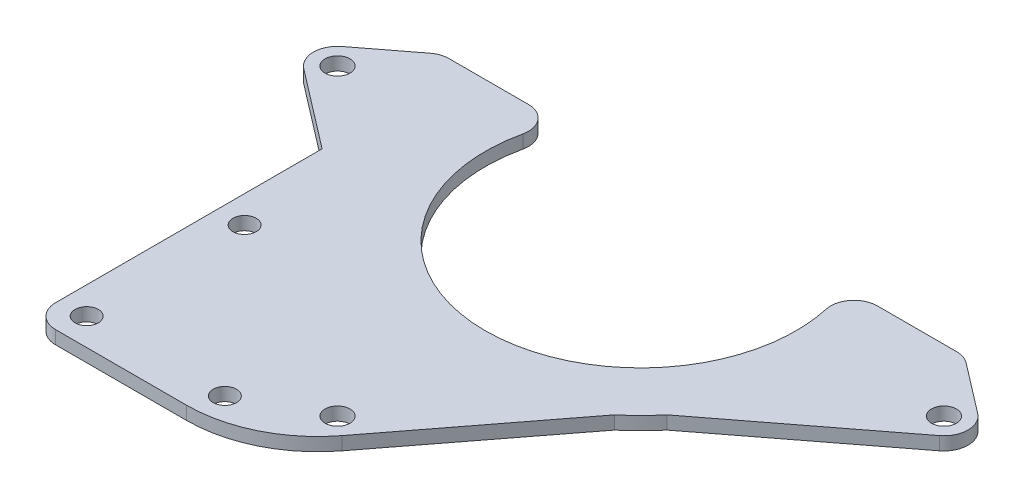
ISO-10303-21;
HEADER;
FILE_DESCRIPTION(('STEP AP214'),'2;1');
FILE_NAME('part.step','',(''),(''),'','','');
FILE_SCHEMA(('AUTOMOTIVE_DESIGN { 1 0 10303 214 1 1 1 1 }'));
ENDSEC;
DATA;
#1=APPLICATION_CONTEXT('core data for automotive mechanical design processes');
#2=APPLICATION_PROTOCOL_DEFINITION('international standard','automotive_design',2000,#1);
#3=PRODUCT_CONTEXT('',#1,'mechanical');
#4=PRODUCT('Part','Part','',(#3));
#5=PRODUCT_RELATED_PRODUCT_CATEGORY('part','',(#4));
#6=PRODUCT_DEFINITION_FORMATION('','',#4);
#7=PRODUCT_DEFINITION_CONTEXT('part definition',#1,'design');
#8=PRODUCT_DEFINITION('design','',#6,#7);
#9=PRODUCT_DEFINITION_SHAPE('','',#8);
#10=(LENGTH_UNIT() NAMED_UNIT(*) SI_UNIT(.MILLI.,.METRE.));
#11=(NAMED_UNIT(*) PLANE_ANGLE_UNIT() SI_UNIT($,.RADIAN.));
#12=(NAMED_UNIT(*) SI_UNIT($,.STERADIAN.) SOLID_ANGLE_UNIT());
#13=UNCERTAINTY_MEASURE_WITH_UNIT(LENGTH_MEASURE(1.E-05),#10,'distance_accuracy_value','');
#14=(GEOMETRIC_REPRESENTATION_CONTEXT(3) GLOBAL_UNCERTAINTY_ASSIGNED_CONTEXT((#13)) GLOBAL_UNIT_ASSIGNED_CONTEXT((#10,
#11,#12)) REPRESENTATION_CONTEXT('',''));
#15=CARTESIAN_POINT('',(0.,0.,0.));
#16=DIRECTION('',(0.,0.,1.));
#17=DIRECTION('',(1.,0.,0.));
#18=AXIS2_PLACEMENT_3D('',#15,#16,#17);
#19=CARTESIAN_POINT('',(-16.3370642064992,1.7,-21.3024503239142));
#20=DIRECTION('',(-0.608553193172273,0.,-0.793513081858031));
#21=DIRECTION('',(-0.793513081858031,0.,0.608553193172273));
#22=AXIS2_PLACEMENT_3D('',#19,#20,#21);
#23=PLANE('',#22);
#24=DIRECTION('',(0.793513081858031,0.,-0.608553193172273));
#25=VECTOR('',#24,1.);
#26=CARTESIAN_POINT('',(-16.3370642064992,1.7,-21.3024503239142));
#27=LINE('',#26,#25);
#28=CARTESIAN_POINT('',(-40.906514898834,1.7,-2.45989055376017));
#29=VERTEX_POINT('',#28);
#30=CARTESIAN_POINT('',(-34.4903147178306,1.7,-7.38053924557437));
#31=VERTEX_POINT('',#30);
#32=EDGE_CURVE('E231',#29,#31,#27,.T.);
#33=ORIENTED_EDGE('',*,*,#32,.T.);
#34=DIRECTION('',(0.,1.,0.));
#35=VECTOR('',#34,1.);
#36=CARTESIAN_POINT('',(-34.4903147178306,0.,-7.38053924557437));
#37=LINE('',#36,#35);
#38=CARTESIAN_POINT('',(-34.4903147178306,0.,-7.38053924557437));
#39=VERTEX_POINT('',#38);
#40=EDGE_CURVE('E393',#31,#39,#37,.F.);
#41=ORIENTED_EDGE('',*,*,#40,.T.);
#42=DIRECTION('',(0.793513081858031,0.,-0.608553193172273));
#43=VECTOR('',#42,1.);
#44=CARTESIAN_POINT('',(-16.3370642064992,0.,-21.3024503239142));
#45=LINE('',#44,#43);
#46=CARTESIAN_POINT('',(-40.906514898834,0.,-2.45989055376017));
#47=VERTEX_POINT('',#46);
#48=EDGE_CURVE('E224',#47,#39,#45,.T.);
#49=ORIENTED_EDGE('',*,*,#48,.F.);
#50=DIRECTION('',(0.,-1.,0.));
#51=VECTOR('',#50,1.);
#52=CARTESIAN_POINT('',(-40.906514898834,1.7,-2.45989055376017));
#53=LINE('',#52,#51);
#54=EDGE_CURVE('E333',#29,#47,#53,.T.);
#55=ORIENTED_EDGE('',*,*,#54,.F.);
#56=EDGE_LOOP('',(#33,#41,#49,#55));
#57=FACE_BOUND('',#56,.T.);
#58=ADVANCED_FACE('F51',(#57),#23,.T.);
#59=CARTESIAN_POINT('',(-39.02,1.7,-2.72475203683318E-13));
#60=DIRECTION('',(0.,-1.,0.));
#61=DIRECTION('',(0.,0.,-1.));
#62=AXIS2_PLACEMENT_3D('',#59,#60,#61);
#63=CYLINDRICAL_SURFACE('',#62,3.1);
#64=CARTESIAN_POINT('',(-39.02,0.,-2.72475203683318E-13));
#65=DIRECTION('',(0.,1.,0.));
#66=DIRECTION('',(0.,0.,1.));
#67=AXIS2_PLACEMENT_3D('',#64,#65,#66);
#68=CIRCLE('',#67,3.1);
#69=CARTESIAN_POINT('',(-40.9065148988341,0.,2.4598905537596));
#70=VERTEX_POINT('',#69);
#71=EDGE_CURVE('E280',#47,#70,#68,.T.);
#72=ORIENTED_EDGE('',*,*,#71,.T.);
#73=DIRECTION('',(0.,-1.,0.));
#74=VECTOR('',#73,1.);
#75=CARTESIAN_POINT('',(-40.9065148988341,1.7,2.4598905537596));
#76=LINE('',#75,#74);
#77=CARTESIAN_POINT('',(-40.9065148988341,1.7,2.4598905537596));
#78=VERTEX_POINT('',#77);
#79=EDGE_CURVE('E329',#78,#70,#76,.T.);
#80=ORIENTED_EDGE('',*,*,#79,.F.);
#81=CARTESIAN_POINT('',(-39.02,1.7,-2.72475203683318E-13));
#82=DIRECTION('',(0.,1.,0.));
#83=DIRECTION('',(0.,0.,1.));
#84=AXIS2_PLACEMENT_3D('',#81,#82,#83);
#85=CIRCLE('',#84,3.1);
#86=EDGE_CURVE('E235',#29,#78,#85,.T.);
#87=ORIENTED_EDGE('',*,*,#86,.F.);
#88=ORIENTED_EDGE('',*,*,#54,.T.);
#89=EDGE_LOOP('',(#72,#80,#87,#88));
#90=FACE_BOUND('',#89,.T.);
#91=ADVANCED_FACE('F478',(#90),#63,.T.);
#92=CARTESIAN_POINT('',(-16.3370642064995,1.7,21.302450323914));
#93=DIRECTION('',(-0.608553193172284,0.,0.793513081858022));
#94=DIRECTION('',(0.793513081858022,0.,0.608553193172284));
#95=AXIS2_PLACEMENT_3D('',#92,#93,#94);
#96=PLANE('',#95);
#97=DIRECTION('',(0.,1.,0.));
#98=VECTOR('',#97,1.);
#99=CARTESIAN_POINT('',(-30.78,0.,10.2260170591507));
#100=LINE('',#99,#98);
#101=CARTESIAN_POINT('',(-30.78,0.,10.2260170591507));
#102=VERTEX_POINT('',#101);
#103=CARTESIAN_POINT('',(-30.78,1.7,10.2260170591507));
#104=VERTEX_POINT('',#103);
#105=EDGE_CURVE('E198',#102,#104,#100,.T.);
#106=ORIENTED_EDGE('',*,*,#105,.T.);
#107=DIRECTION('',(-0.793513081858022,0.,-0.608553193172284));
#108=VECTOR('',#107,1.);
#109=CARTESIAN_POINT('',(-16.3370642064995,1.7,21.302450323914));
#110=LINE('',#109,#108);
#111=EDGE_CURVE('E240',#104,#78,#110,.T.);
#112=ORIENTED_EDGE('',*,*,#111,.T.);
#113=ORIENTED_EDGE('',*,*,#79,.T.);
#114=DIRECTION('',(-0.793513081858022,0.,-0.608553193172284));
#115=VECTOR('',#114,1.);
#116=CARTESIAN_POINT('',(-16.3370642064995,0.,21.302450323914));
#117=LINE('',#116,#115);
#118=EDGE_CURVE('E284',#102,#70,#117,.T.);
#119=ORIENTED_EDGE('',*,*,#118,.F.);
#120=EDGE_LOOP('',(#106,#112,#113,#119));
#121=FACE_BOUND('',#120,.T.);
#122=ADVANCED_FACE('F412',(#121),#96,.T.);
#123=CARTESIAN_POINT('',(21.302450323914,1.7,16.3370642064994));
#124=DIRECTION('',(0.793513081858025,0.,0.608553193172281));
#125=DIRECTION('',(0.608553193172281,0.,-0.793513081858025));
#126=AXIS2_PLACEMENT_3D('',#123,#124,#125);
#127=PLANE('',#126);
#128=DIRECTION('',(-0.608553193172281,0.,0.793513081858025));
#129=VECTOR('',#128,1.);
#130=CARTESIAN_POINT('',(21.302450323914,0.,16.3370642064994));
#131=LINE('',#130,#129);
#132=CARTESIAN_POINT('',(17.6737203830668,0.,21.0686878523835));
#133=VERTEX_POINT('',#132);
#134=CARTESIAN_POINT('',(2.45989055375975,0.,40.9065148988341));
#135=VERTEX_POINT('',#134);
#136=EDGE_CURVE('E206',#133,#135,#131,.T.);
#137=ORIENTED_EDGE('',*,*,#136,.F.);
#138=DIRECTION('',(0.,-1.,0.));
#139=VECTOR('',#138,1.);
#140=CARTESIAN_POINT('',(17.6737203830668,1.7,21.0686878523835));
#141=LINE('',#140,#139);
#142=CARTESIAN_POINT('',(17.6737203830668,1.7,21.0686878523835));
#143=VERTEX_POINT('',#142);
#144=EDGE_CURVE('E323',#143,#133,#141,.T.);
#145=ORIENTED_EDGE('',*,*,#144,.F.);
#146=DIRECTION('',(-0.608553193172281,0.,0.793513081858025));
#147=VECTOR('',#146,1.);
#148=CARTESIAN_POINT('',(21.302450323914,1.7,16.3370642064994));
#149=LINE('',#148,#147);
#150=CARTESIAN_POINT('',(2.45989055375975,1.7,40.9065148988341));
#151=VERTEX_POINT('',#150);
#152=EDGE_CURVE('E230',#143,#151,#149,.T.);
#153=ORIENTED_EDGE('',*,*,#152,.T.);
#154=DIRECTION('',(0.,-1.,0.));
#155=VECTOR('',#154,1.);
#156=CARTESIAN_POINT('',(2.45989055375975,1.7,40.9065148988341));
#157=LINE('',#156,#155);
#158=EDGE_CURVE('E326',#151,#135,#157,.T.);
#159=ORIENTED_EDGE('',*,*,#158,.T.);
#160=EDGE_LOOP('',(#137,#145,#153,#159));
#161=FACE_BOUND('',#160,.T.);
#162=ADVANCED_FACE('F535',(#161),#127,.T.);
#163=CARTESIAN_POINT('',(0.,1.7,0.));
#164=DIRECTION('',(0.,-1.,0.));
#165=DIRECTION('',(0.,0.,-1.));
#166=AXIS2_PLACEMENT_3D('',#163,#164,#165);
#167=CYLINDRICAL_SURFACE('',#166,27.5);
#168=CARTESIAN_POINT('',(0.,0.,0.));
#169=DIRECTION('',(0.,1.,0.));
#170=DIRECTION('',(0.,0.,1.));
#171=AXIS2_PLACEMENT_3D('',#168,#169,#170);
#172=CIRCLE('',#171,27.5);
#173=CARTESIAN_POINT('',(21.0686878523834,0.,17.6737203830668));
#174=VERTEX_POINT('',#173);
#175=EDGE_CURVE('E272',#133,#174,#172,.T.);
#176=ORIENTED_EDGE('',*,*,#175,.T.);
#177=DIRECTION('',(0.,-1.,0.));
#178=VECTOR('',#177,1.);
#179=CARTESIAN_POINT('',(21.0686878523834,1.7,17.6737203830668));
#180=LINE('',#179,#178);
#181=CARTESIAN_POINT('',(21.0686878523834,1.7,17.6737203830668));
#182=VERTEX_POINT('',#181);
#183=EDGE_CURVE('E320',#182,#174,#180,.T.);
#184=ORIENTED_EDGE('',*,*,#183,.F.);
#185=CARTESIAN_POINT('',(0.,1.7,0.));
#186=DIRECTION('',(0.,1.,0.));
#187=DIRECTION('',(0.,0.,1.));
#188=AXIS2_PLACEMENT_3D('',#185,#186,#187);
#189=CIRCLE('',#188,27.5);
#190=EDGE_CURVE('E226',#143,#182,#189,.T.);
#191=ORIENTED_EDGE('',*,*,#190,.F.);
#192=ORIENTED_EDGE('',*,*,#144,.T.);
#193=EDGE_LOOP('',(#176,#184,#191,#192));
#194=FACE_BOUND('',#193,.T.);
#195=ADVANCED_FACE('F533',(#194),#167,.T.);
#196=CARTESIAN_POINT('',(16.3370642064993,1.7,21.3024503239141));
#197=DIRECTION('',(0.608553193172279,0.,0.793513081858027));
#198=DIRECTION('',(0.793513081858027,0.,-0.608553193172279));
#199=AXIS2_PLACEMENT_3D('',#196,#197,#198);
#200=PLANE('',#199);
#201=DIRECTION('',(-0.793513081858027,0.,0.608553193172279));
#202=VECTOR('',#201,1.);
#203=CARTESIAN_POINT('',(16.3370642064993,0.,21.3024503239141));
#204=LINE('',#203,#202);
#205=CARTESIAN_POINT('',(40.9065148988341,0.,2.45989055375989));
#206=VERTEX_POINT('',#205);
#207=EDGE_CURVE('E276',#206,#174,#204,.T.);
#208=ORIENTED_EDGE('',*,*,#207,.F.);
#209=DIRECTION('',(0.,-1.,0.));
#210=VECTOR('',#209,1.);
#211=CARTESIAN_POINT('',(40.9065148988341,1.7,2.45989055375989));
#212=LINE('',#211,#210);
#213=CARTESIAN_POINT('',(40.9065148988341,1.7,2.45989055375989));
#214=VERTEX_POINT('',#213);
#215=EDGE_CURVE('E317',#214,#206,#212,.T.);
#216=ORIENTED_EDGE('',*,*,#215,.F.);
#217=DIRECTION('',(-0.793513081858027,0.,0.608553193172279));
#218=VECTOR('',#217,1.);
#219=CARTESIAN_POINT('',(16.3370642064993,1.7,21.3024503239141));
#220=LINE('',#219,#218);
#221=EDGE_CURVE('E229',#214,#182,#220,.T.);
#222=ORIENTED_EDGE('',*,*,#221,.T.);
#223=ORIENTED_EDGE('',*,*,#183,.T.);
#224=EDGE_LOOP('',(#208,#216,#222,#223));
#225=FACE_BOUND('',#224,.T.);
#226=ADVANCED_FACE('F528',(#225),#200,.T.);
#227=CARTESIAN_POINT('',(39.02,1.7,0.));
#228=DIRECTION('',(0.,-1.,0.));
#229=DIRECTION('',(0.,0.,-1.));
#230=AXIS2_PLACEMENT_3D('',#227,#228,#229);
#231=CYLINDRICAL_SURFACE('',#230,3.1);
#232=CARTESIAN_POINT('',(39.02,0.,0.));
#233=DIRECTION('',(0.,1.,0.));
#234=DIRECTION('',(0.,0.,1.));
#235=AXIS2_PLACEMENT_3D('',#232,#233,#234);
#236=CIRCLE('',#235,3.1);
#237=CARTESIAN_POINT('',(40.9065148988341,0.,-2.45989055375988));
#238=VERTEX_POINT('',#237);
#239=EDGE_CURVE('E292',#206,#238,#236,.T.);
#240=ORIENTED_EDGE('',*,*,#239,.T.);
#241=DIRECTION('',(0.,-1.,0.));
#242=VECTOR('',#241,1.);
#243=CARTESIAN_POINT('',(40.9065148988341,1.7,-2.45989055375988));
#244=LINE('',#243,#242);
#245=CARTESIAN_POINT('',(40.9065148988341,1.7,-2.45989055375988));
#246=VERTEX_POINT('',#245);
#247=EDGE_CURVE('E271',#246,#238,#244,.T.);
#248=ORIENTED_EDGE('',*,*,#247,.F.);
#249=CARTESIAN_POINT('',(39.02,1.7,0.));
#250=DIRECTION('',(0.,1.,0.));
#251=DIRECTION('',(0.,0.,1.));
#252=AXIS2_PLACEMENT_3D('',#249,#250,#251);
#253=CIRCLE('',#252,3.1);
#254=EDGE_CURVE('E248',#214,#246,#253,.T.);
#255=ORIENTED_EDGE('',*,*,#254,.F.);
#256=ORIENTED_EDGE('',*,*,#215,.T.);
#257=EDGE_LOOP('',(#240,#248,#255,#256));
#258=FACE_BOUND('',#257,.T.);
#259=ADVANCED_FACE('F525',(#258),#231,.T.);
#260=CARTESIAN_POINT('',(16.3370642064993,1.7,-21.3024503239141));
#261=DIRECTION('',(0.608553193172278,0.,-0.793513081858027));
#262=DIRECTION('',(-0.793513081858027,0.,-0.608553193172278));
#263=AXIS2_PLACEMENT_3D('',#260,#261,#262);
#264=PLANE('',#263);
#265=DIRECTION('',(0.793513081858027,0.,0.608553193172278));
#266=VECTOR('',#265,1.);
#267=CARTESIAN_POINT('',(16.3370642064993,0.,-21.3024503239141));
#268=LINE('',#267,#266);
#269=CARTESIAN_POINT('',(34.4903147178303,0.,-7.38053924557435));
#270=VERTEX_POINT('',#269);
#271=EDGE_CURVE('E296',#270,#238,#268,.T.);
#272=ORIENTED_EDGE('',*,*,#271,.F.);
#273=DIRECTION('',(0.,1.,0.));
#274=VECTOR('',#273,1.);
#275=CARTESIAN_POINT('',(34.4903147178303,1.7,-7.38053924557435));
#276=LINE('',#275,#274);
#277=CARTESIAN_POINT('',(34.4903147178303,1.7,-7.38053924557435));
#278=VERTEX_POINT('',#277);
#279=EDGE_CURVE('E339',#270,#278,#276,.T.);
#280=ORIENTED_EDGE('',*,*,#279,.T.);
#281=DIRECTION('',(0.793513081858027,0.,0.608553193172278));
#282=VECTOR('',#281,1.);
#283=CARTESIAN_POINT('',(16.3370642064993,1.7,-21.3024503239141));
#284=LINE('',#283,#282);
#285=EDGE_CURVE('E252',#278,#246,#284,.T.);
#286=ORIENTED_EDGE('',*,*,#285,.T.);
#287=ORIENTED_EDGE('',*,*,#247,.T.);
#288=EDGE_LOOP('',(#272,#280,#286,#287));
#289=FACE_BOUND('',#288,.T.);
#290=ADVANCED_FACE('F521',(#289),#264,.T.);
#291=CARTESIAN_POINT('',(-1.36237601841659E-13,1.7,39.02));
#292=DIRECTION('',(0.,-1.,0.));
#293=DIRECTION('',(0.,0.,-1.));
#294=AXIS2_PLACEMENT_3D('',#291,#292,#293);
#295=CYLINDRICAL_SURFACE('',#294,1.6);
#296=CARTESIAN_POINT('',(-1.36237601841659E-13,1.7,39.02));
#297=DIRECTION('',(0.,1.,0.));
#298=DIRECTION('',(0.,0.,1.));
#299=AXIS2_PLACEMENT_3D('',#296,#297,#298);
#300=CIRCLE('',#299,1.6);
#301=CARTESIAN_POINT('',(-1.36237601841659E-13,1.7,40.62));
#302=VERTEX_POINT('',#301);
#303=EDGE_CURVE('E263',#302,#302,#300,.T.);
#304=ORIENTED_EDGE('',*,*,#303,.T.);
#305=EDGE_LOOP('',(#304));
#306=FACE_BOUND('',#305,.T.);
#307=CARTESIAN_POINT('',(-1.36237601841659E-13,0.,39.02));
#308=DIRECTION('',(0.,1.,0.));
#309=DIRECTION('',(0.,0.,1.));
#310=AXIS2_PLACEMENT_3D('',#307,#308,#309);
#311=CIRCLE('',#310,1.6);
#312=CARTESIAN_POINT('',(-1.36237601841659E-13,0.,40.62));
#313=VERTEX_POINT('',#312);
#314=EDGE_CURVE('E307',#313,#313,#311,.T.);
#315=ORIENTED_EDGE('',*,*,#314,.F.);
#316=EDGE_LOOP('',(#315));
#317=FACE_BOUND('',#316,.T.);
#318=ADVANCED_FACE('F550',(#306,#317),#295,.F.);
#319=CARTESIAN_POINT('',(39.02,1.7,0.));
#320=DIRECTION('',(0.,-1.,0.));
#321=DIRECTION('',(0.,0.,-1.));
#322=AXIS2_PLACEMENT_3D('',#319,#320,#321);
#323=CYLINDRICAL_SURFACE('',#322,1.60000000000001);
#324=CARTESIAN_POINT('',(39.02,1.7,0.));
#325=DIRECTION('',(0.,1.,0.));
#326=DIRECTION('',(0.,0.,1.));
#327=AXIS2_PLACEMENT_3D('',#324,#325,#326);
#328=CIRCLE('',#327,1.60000000000001);
#329=CARTESIAN_POINT('',(39.02,1.7,1.60000000000001));
#330=VERTEX_POINT('',#329);
#331=EDGE_CURVE('E259',#330,#330,#328,.T.);
#332=ORIENTED_EDGE('',*,*,#331,.T.);
#333=EDGE_LOOP('',(#332));
#334=FACE_BOUND('',#333,.T.);
#335=CARTESIAN_POINT('',(39.02,0.,0.));
#336=DIRECTION('',(0.,1.,0.));
#337=DIRECTION('',(0.,0.,1.));
#338=AXIS2_PLACEMENT_3D('',#335,#336,#337);
#339=CIRCLE('',#338,1.60000000000001);
#340=CARTESIAN_POINT('',(39.02,0.,1.60000000000001));
#341=VERTEX_POINT('',#340);
#342=EDGE_CURVE('E303',#341,#341,#339,.T.);
#343=ORIENTED_EDGE('',*,*,#342,.F.);
#344=EDGE_LOOP('',(#343));
#345=FACE_BOUND('',#344,.T.);
#346=ADVANCED_FACE('F554',(#334,#345),#323,.F.);
#347=CARTESIAN_POINT('',(0.,1.7,0.));
#348=DIRECTION('',(0.,-1.,0.));
#349=DIRECTION('',(0.,0.,-1.));
#350=AXIS2_PLACEMENT_3D('',#347,#348,#349);
#351=CYLINDRICAL_SURFACE('',#350,20.);
#352=CARTESIAN_POINT('',(0.,1.7,0.));
#353=DIRECTION('',(0.,1.,0.));
#354=DIRECTION('',(0.,0.,1.));
#355=AXIS2_PLACEMENT_3D('',#352,#353,#354);
#356=CIRCLE('',#355,20.);
#357=CARTESIAN_POINT('',(-19.5216907136031,1.7,-4.34782608695676));
#358=VERTEX_POINT('',#357);
#359=CARTESIAN_POINT('',(19.5216907136031,1.7,-4.34782608695676));
#360=VERTEX_POINT('',#359);
#361=EDGE_CURVE('E255',#358,#360,#356,.T.);
#362=ORIENTED_EDGE('',*,*,#361,.T.);
#363=DIRECTION('',(0.,-1.,0.));
#364=VECTOR('',#363,1.);
#365=CARTESIAN_POINT('',(19.5216907136031,1.7,-4.34782608695676));
#366=LINE('',#365,#364);
#367=CARTESIAN_POINT('',(19.5216907136031,0.,-4.34782608695676));
#368=VERTEX_POINT('',#367);
#369=EDGE_CURVE('E382',#360,#368,#366,.T.);
#370=ORIENTED_EDGE('',*,*,#369,.T.);
#371=CARTESIAN_POINT('',(0.,0.,0.));
#372=DIRECTION('',(0.,1.,0.));
#373=DIRECTION('',(0.,0.,1.));
#374=AXIS2_PLACEMENT_3D('',#371,#372,#373);
#375=CIRCLE('',#374,20.);
#376=CARTESIAN_POINT('',(-19.5216907136031,0.,-4.34782608695676));
#377=VERTEX_POINT('',#376);
#378=EDGE_CURVE('E299',#377,#368,#375,.T.);
#379=ORIENTED_EDGE('',*,*,#378,.F.);
#380=DIRECTION('',(0.,-1.,0.));
#381=VECTOR('',#380,1.);
#382=CARTESIAN_POINT('',(-19.5216907136031,1.7,-4.34782608695676));
#383=LINE('',#382,#381);
#384=EDGE_CURVE('E379',#377,#358,#383,.F.);
#385=ORIENTED_EDGE('',*,*,#384,.T.);
#386=EDGE_LOOP('',(#362,#370,#379,#385));
#387=FACE_BOUND('',#386,.T.);
#388=ADVANCED_FACE('F473',(#387),#351,.F.);
#389=CARTESIAN_POINT('',(-39.02,1.7,-2.72475203683318E-13));
#390=DIRECTION('',(0.,-1.,0.));
#391=DIRECTION('',(0.,0.,-1.));
#392=AXIS2_PLACEMENT_3D('',#389,#390,#391);
#393=CYLINDRICAL_SURFACE('',#392,1.6);
#394=CARTESIAN_POINT('',(-39.02,1.7,-2.72475203683318E-13));
#395=DIRECTION('',(0.,1.,0.));
#396=DIRECTION('',(0.,0.,1.));
#397=AXIS2_PLACEMENT_3D('',#394,#395,#396);
#398=CIRCLE('',#397,1.6);
#399=CARTESIAN_POINT('',(-39.02,1.7,1.59999999999973));
#400=VERTEX_POINT('',#399);
#401=EDGE_CURVE('E267',#400,#400,#398,.T.);
#402=ORIENTED_EDGE('',*,*,#401,.T.);
#403=EDGE_LOOP('',(#402));
#404=FACE_BOUND('',#403,.T.);
#405=CARTESIAN_POINT('',(-39.02,0.,-2.72475203683318E-13));
#406=DIRECTION('',(0.,1.,0.));
#407=DIRECTION('',(0.,0.,1.));
#408=AXIS2_PLACEMENT_3D('',#405,#406,#407);
#409=CIRCLE('',#408,1.6);
#410=CARTESIAN_POINT('',(-39.02,0.,1.59999999999973));
#411=VERTEX_POINT('',#410);
#412=EDGE_CURVE('E236',#411,#411,#409,.T.);
#413=ORIENTED_EDGE('',*,*,#412,.F.);
#414=EDGE_LOOP('',(#413));
#415=FACE_BOUND('',#414,.T.);
#416=ADVANCED_FACE('F465',(#404,#415),#393,.F.);
#417=CARTESIAN_POINT('',(0.,1.7,0.));
#418=DIRECTION('',(0.,1.,0.));
#419=DIRECTION('',(0.,0.,1.));
#420=AXIS2_PLACEMENT_3D('',#417,#418,#419);
#421=PLANE('',#420);
#422=ORIENTED_EDGE('',*,*,#285,.F.);
#423=CARTESIAN_POINT('',(32.6646551383135,1.7,-5.00000000000027));
#424=DIRECTION('',(0.,1.,0.));
#425=DIRECTION('',(0.,0.,1.));
#426=AXIS2_PLACEMENT_3D('',#423,#424,#425);
#427=CIRCLE('',#426,3.);
#428=CARTESIAN_POINT('',(32.6646551383135,1.7,-8.00000000000027));
#429=VERTEX_POINT('',#428);
#430=EDGE_CURVE('E355',#278,#429,#427,.T.);
#431=ORIENTED_EDGE('',*,*,#430,.T.);
#432=DIRECTION('',(1.,0.,0.));
#433=VECTOR('',#432,1.);
#434=CARTESIAN_POINT('',(-33.6825788981034,1.7,-8.00000000000027));
#435=LINE('',#434,#433);
#436=CARTESIAN_POINT('',(22.4499443206436,1.7,-8.00000000000027));
#437=VERTEX_POINT('',#436);
#438=EDGE_CURVE('E439',#437,#429,#435,.T.);
#439=ORIENTED_EDGE('',*,*,#438,.F.);
#440=CARTESIAN_POINT('',(22.4499443206436,1.7,-5.00000000000027));
#441=DIRECTION('',(0.,1.,0.));
#442=DIRECTION('',(0.,0.,1.));
#443=AXIS2_PLACEMENT_3D('',#440,#441,#442);
#444=CIRCLE('',#443,3.);
#445=EDGE_CURVE('E352',#437,#360,#444,.T.);
#446=ORIENTED_EDGE('',*,*,#445,.T.);
#447=ORIENTED_EDGE('',*,*,#361,.F.);
#448=CARTESIAN_POINT('',(-22.4499443206436,1.7,-5.00000000000027));
#449=DIRECTION('',(0.,1.,0.));
#450=DIRECTION('',(0.,0.,1.));
#451=AXIS2_PLACEMENT_3D('',#448,#449,#450);
#452=CIRCLE('',#451,3.);
#453=CARTESIAN_POINT('',(-22.4499443206436,1.7,-8.00000000000027));
#454=VERTEX_POINT('',#453);
#455=EDGE_CURVE('E346',#358,#454,#452,.T.);
#456=ORIENTED_EDGE('',*,*,#455,.T.);
#457=CARTESIAN_POINT('',(-32.6646551383138,1.7,-8.00000000000027));
#458=VERTEX_POINT('',#457);
#459=EDGE_CURVE('E432',#458,#454,#435,.T.);
#460=ORIENTED_EDGE('',*,*,#459,.F.);
#461=CARTESIAN_POINT('',(-32.6646551383138,1.7,-5.00000000000027));
#462=DIRECTION('',(0.,1.,0.));
#463=DIRECTION('',(0.,0.,1.));
#464=AXIS2_PLACEMENT_3D('',#461,#462,#463);
#465=CIRCLE('',#464,3.);
#466=EDGE_CURVE('E349',#458,#31,#465,.T.);
#467=ORIENTED_EDGE('',*,*,#466,.T.);
#468=ORIENTED_EDGE('',*,*,#32,.F.);
#469=ORIENTED_EDGE('',*,*,#86,.T.);
#470=ORIENTED_EDGE('',*,*,#111,.F.);
#471=DIRECTION('',(0.,0.,1.));
#472=VECTOR('',#471,1.);
#473=CARTESIAN_POINT('',(-30.78,1.7,47.52));
#474=LINE('',#473,#472);
#475=CARTESIAN_POINT('',(-30.78,1.7,44.52));
#476=VERTEX_POINT('',#475);
#477=EDGE_CURVE('E189',#104,#476,#474,.T.);
#478=ORIENTED_EDGE('',*,*,#477,.T.);
#479=CARTESIAN_POINT('',(-27.78,1.7,44.52));
#480=DIRECTION('',(0.,1.,0.));
#481=DIRECTION('',(0.,0.,1.));
#482=AXIS2_PLACEMENT_3D('',#479,#480,#481);
#483=CIRCLE('',#482,3.);
#484=CARTESIAN_POINT('',(-27.78,1.7,47.52));
#485=VERTEX_POINT('',#484);
#486=EDGE_CURVE('E343',#476,#485,#483,.T.);
#487=ORIENTED_EDGE('',*,*,#486,.T.);
#488=DIRECTION('',(1.,0.,0.));
#489=VECTOR('',#488,1.);
#490=CARTESIAN_POINT('',(-30.78,1.7,47.52));
#491=LINE('',#490,#489);
#492=CARTESIAN_POINT('',(-10.9464953278294,1.7,47.52));
#493=VERTEX_POINT('',#492);
#494=EDGE_CURVE('E214',#485,#493,#491,.T.);
#495=ORIENTED_EDGE('',*,*,#494,.T.);
#496=CARTESIAN_POINT('',(-10.9464953278294,1.7,30.6250222257232));
#497=DIRECTION('',(0.,1.,0.));
#498=DIRECTION('',(0.,0.,-1.));
#499=AXIS2_PLACEMENT_3D('',#496,#497,#498);
#500=CIRCLE('',#499,16.8949777742768);
#501=EDGE_CURVE('E196',#493,#151,#500,.T.);
#502=ORIENTED_EDGE('',*,*,#501,.T.);
#503=ORIENTED_EDGE('',*,*,#152,.F.);
#504=ORIENTED_EDGE('',*,*,#190,.T.);
#505=ORIENTED_EDGE('',*,*,#221,.F.);
#506=ORIENTED_EDGE('',*,*,#254,.T.);
#507=EDGE_LOOP('',(#422,#431,#439,#446,#447,#456,#460,#467,#468,#469,#470,#478,#487,#495,#502,
#503,#504,#505,#506));
#508=FACE_BOUND('',#507,.T.);
#509=ORIENTED_EDGE('',*,*,#331,.F.);
#510=EDGE_LOOP('',(#509));
#511=FACE_BOUND('',#510,.T.);
#512=ORIENTED_EDGE('',*,*,#303,.F.);
#513=EDGE_LOOP('',(#512));
#514=FACE_BOUND('',#513,.T.);
#515=ORIENTED_EDGE('',*,*,#401,.F.);
#516=EDGE_LOOP('',(#515));
#517=FACE_BOUND('',#516,.T.);
#518=CARTESIAN_POINT('',(-27.28,1.7,44.02));
#519=DIRECTION('',(0.,1.,0.));
#520=DIRECTION('',(0.,0.,1.));
#521=AXIS2_PLACEMENT_3D('',#518,#519,#520);
#522=CIRCLE('',#521,1.5);
#523=CARTESIAN_POINT('',(-27.28,1.7,45.52));
#524=VERTEX_POINT('',#523);
#525=EDGE_CURVE('E431',#524,#524,#522,.T.);
#526=ORIENTED_EDGE('',*,*,#525,.F.);
#527=EDGE_LOOP('',(#526));
#528=FACE_BOUND('',#527,.T.);
#529=CARTESIAN_POINT('',(-27.28,1.7,23.7));
#530=DIRECTION('',(0.,1.,0.));
#531=DIRECTION('',(0.,0.,1.));
#532=AXIS2_PLACEMENT_3D('',#529,#530,#531);
#533=CIRCLE('',#532,1.5);
#534=CARTESIAN_POINT('',(-27.28,1.7,25.2));
#535=VERTEX_POINT('',#534);
#536=EDGE_CURVE('E446',#535,#535,#533,.T.);
#537=ORIENTED_EDGE('',*,*,#536,.F.);
#538=EDGE_LOOP('',(#537));
#539=FACE_BOUND('',#538,.T.);
#540=CARTESIAN_POINT('',(-9.5,1.7,44.02));
#541=DIRECTION('',(0.,1.,0.));
#542=DIRECTION('',(0.,0.,1.));
#543=AXIS2_PLACEMENT_3D('',#540,#541,#542);
#544=CIRCLE('',#543,1.5);
#545=CARTESIAN_POINT('',(-9.5,1.7,45.52));
#546=VERTEX_POINT('',#545);
#547=EDGE_CURVE('E452',#546,#546,#544,.T.);
#548=ORIENTED_EDGE('',*,*,#547,.F.);
#549=EDGE_LOOP('',(#548));
#550=FACE_BOUND('',#549,.T.);
#551=ADVANCED_FACE('F406',(#508,#511,#514,#517,#528,#539,#550),#421,.T.);
#552=CARTESIAN_POINT('',(0.,0.,0.));
#553=DIRECTION('',(0.,1.,0.));
#554=DIRECTION('',(0.,0.,1.));
#555=AXIS2_PLACEMENT_3D('',#552,#553,#554);
#556=PLANE('',#555);
#557=DIRECTION('',(1.,0.,0.));
#558=VECTOR('',#557,1.);
#559=CARTESIAN_POINT('',(0.,0.,-8.00000000000027));
#560=LINE('',#559,#558);
#561=CARTESIAN_POINT('',(22.4499443206436,0.,-8.00000000000027));
#562=VERTEX_POINT('',#561);
#563=CARTESIAN_POINT('',(32.6646551383135,0.,-8.00000000000027));
#564=VERTEX_POINT('',#563);
#565=EDGE_CURVE('E336',#562,#564,#560,.T.);
#566=ORIENTED_EDGE('',*,*,#565,.T.);
#567=CARTESIAN_POINT('',(32.6646551383135,0.,-5.00000000000027));
#568=DIRECTION('',(0.,1.,0.));
#569=DIRECTION('',(0.,0.,1.));
#570=AXIS2_PLACEMENT_3D('',#567,#568,#569);
#571=CIRCLE('',#570,3.);
#572=EDGE_CURVE('E376',#564,#270,#571,.F.);
#573=ORIENTED_EDGE('',*,*,#572,.T.);
#574=ORIENTED_EDGE('',*,*,#271,.T.);
#575=ORIENTED_EDGE('',*,*,#239,.F.);
#576=ORIENTED_EDGE('',*,*,#207,.T.);
#577=ORIENTED_EDGE('',*,*,#175,.F.);
#578=ORIENTED_EDGE('',*,*,#136,.T.);
#579=CARTESIAN_POINT('',(-10.9464953278294,0.,30.6250222257232));
#580=DIRECTION('',(0.,1.,0.));
#581=DIRECTION('',(0.,0.,-1.));
#582=AXIS2_PLACEMENT_3D('',#579,#580,#581);
#583=CIRCLE('',#582,16.8949777742768);
#584=CARTESIAN_POINT('',(-10.9464953278294,0.,47.52));
#585=VERTEX_POINT('',#584);
#586=EDGE_CURVE('E188',#585,#135,#583,.T.);
#587=ORIENTED_EDGE('',*,*,#586,.F.);
#588=DIRECTION('',(1.,0.,0.));
#589=VECTOR('',#588,1.);
#590=CARTESIAN_POINT('',(-30.78,0.,47.52));
#591=LINE('',#590,#589);
#592=CARTESIAN_POINT('',(-27.78,0.,47.52));
#593=VERTEX_POINT('',#592);
#594=EDGE_CURVE('E181',#593,#585,#591,.T.);
#595=ORIENTED_EDGE('',*,*,#594,.F.);
#596=CARTESIAN_POINT('',(-27.78,0.,44.52));
#597=DIRECTION('',(0.,1.,0.));
#598=DIRECTION('',(0.,0.,1.));
#599=AXIS2_PLACEMENT_3D('',#596,#597,#598);
#600=CIRCLE('',#599,3.);
#601=CARTESIAN_POINT('',(-30.78,0.,44.52));
#602=VERTEX_POINT('',#601);
#603=EDGE_CURVE('E67',#593,#602,#600,.F.);
#604=ORIENTED_EDGE('',*,*,#603,.T.);
#605=DIRECTION('',(0.,0.,1.));
#606=VECTOR('',#605,1.);
#607=CARTESIAN_POINT('',(-30.78,0.,47.52));
#608=LINE('',#607,#606);
#609=EDGE_CURVE('E199',#102,#602,#608,.T.);
#610=ORIENTED_EDGE('',*,*,#609,.F.);
#611=ORIENTED_EDGE('',*,*,#118,.T.);
#612=ORIENTED_EDGE('',*,*,#71,.F.);
#613=ORIENTED_EDGE('',*,*,#48,.T.);
#614=CARTESIAN_POINT('',(-32.6646551383138,0.,-5.00000000000027));
#615=DIRECTION('',(0.,1.,0.));
#616=DIRECTION('',(0.,0.,1.));
#617=AXIS2_PLACEMENT_3D('',#614,#615,#616);
#618=CIRCLE('',#617,3.);
#619=CARTESIAN_POINT('',(-32.6646551383138,0.,-8.00000000000027));
#620=VERTEX_POINT('',#619);
#621=EDGE_CURVE('E370',#39,#620,#618,.F.);
#622=ORIENTED_EDGE('',*,*,#621,.T.);
#623=DIRECTION('',(1.,0.,0.));
#624=VECTOR('',#623,1.);
#625=CARTESIAN_POINT('',(-33.6825788981034,0.,-8.00000000000027));
#626=LINE('',#625,#624);
#627=CARTESIAN_POINT('',(-22.4499443206436,0.,-8.00000000000027));
#628=VERTEX_POINT('',#627);
#629=EDGE_CURVE('E424',#620,#628,#626,.T.);
#630=ORIENTED_EDGE('',*,*,#629,.T.);
#631=CARTESIAN_POINT('',(-22.4499443206436,0.,-5.00000000000027));
#632=DIRECTION('',(0.,1.,0.));
#633=DIRECTION('',(0.,0.,1.));
#634=AXIS2_PLACEMENT_3D('',#631,#632,#633);
#635=CIRCLE('',#634,3.);
#636=EDGE_CURVE('E367',#628,#377,#635,.F.);
#637=ORIENTED_EDGE('',*,*,#636,.T.);
#638=ORIENTED_EDGE('',*,*,#378,.T.);
#639=CARTESIAN_POINT('',(22.4499443206436,0.,-5.00000000000027));
#640=DIRECTION('',(0.,1.,0.));
#641=DIRECTION('',(0.,0.,1.));
#642=AXIS2_PLACEMENT_3D('',#639,#640,#641);
#643=CIRCLE('',#642,3.);
#644=EDGE_CURVE('E373',#368,#562,#643,.F.);
#645=ORIENTED_EDGE('',*,*,#644,.T.);
#646=EDGE_LOOP('',(#566,#573,#574,#575,#576,#577,#578,#587,#595,#604,#610,#611,#612,#613,#622,
#630,#637,#638,#645));
#647=FACE_BOUND('',#646,.T.);
#648=ORIENTED_EDGE('',*,*,#342,.T.);
#649=EDGE_LOOP('',(#648));
#650=FACE_BOUND('',#649,.T.);
#651=ORIENTED_EDGE('',*,*,#314,.T.);
#652=EDGE_LOOP('',(#651));
#653=FACE_BOUND('',#652,.T.);
#654=ORIENTED_EDGE('',*,*,#412,.T.);
#655=EDGE_LOOP('',(#654));
#656=FACE_BOUND('',#655,.T.);
#657=CARTESIAN_POINT('',(-27.28,0.,44.02));
#658=DIRECTION('',(0.,1.,0.));
#659=DIRECTION('',(0.,0.,1.));
#660=AXIS2_PLACEMENT_3D('',#657,#658,#659);
#661=CIRCLE('',#660,1.5);
#662=CARTESIAN_POINT('',(-27.28,0.,45.52));
#663=VERTEX_POINT('',#662);
#664=EDGE_CURVE('E437',#663,#663,#661,.T.);
#665=ORIENTED_EDGE('',*,*,#664,.T.);
#666=EDGE_LOOP('',(#665));
#667=FACE_BOUND('',#666,.T.);
#668=CARTESIAN_POINT('',(-27.28,0.,23.7));
#669=DIRECTION('',(0.,1.,0.));
#670=DIRECTION('',(0.,0.,1.));
#671=AXIS2_PLACEMENT_3D('',#668,#669,#670);
#672=CIRCLE('',#671,1.5);
#673=CARTESIAN_POINT('',(-27.28,0.,25.2));
#674=VERTEX_POINT('',#673);
#675=EDGE_CURVE('E448',#674,#674,#672,.T.);
#676=ORIENTED_EDGE('',*,*,#675,.T.);
#677=EDGE_LOOP('',(#676));
#678=FACE_BOUND('',#677,.T.);
#679=CARTESIAN_POINT('',(-9.5,0.,44.02));
#680=DIRECTION('',(0.,1.,0.));
#681=DIRECTION('',(0.,0.,1.));
#682=AXIS2_PLACEMENT_3D('',#679,#680,#681);
#683=CIRCLE('',#682,1.5);
#684=CARTESIAN_POINT('',(-9.5,0.,45.52));
#685=VERTEX_POINT('',#684);
#686=EDGE_CURVE('E217',#685,#685,#683,.T.);
#687=ORIENTED_EDGE('',*,*,#686,.T.);
#688=EDGE_LOOP('',(#687));
#689=FACE_BOUND('',#688,.T.);
#690=ADVANCED_FACE('F202',(#647,#650,#653,#656,#667,#678,#689),#556,.F.);
#691=CARTESIAN_POINT('',(-30.78,0.,47.52));
#692=DIRECTION('',(0.,0.,1.));
#693=DIRECTION('',(1.,0.,0.));
#694=AXIS2_PLACEMENT_3D('',#691,#692,#693);
#695=PLANE('',#694);
#696=ORIENTED_EDGE('',*,*,#494,.F.);
#697=DIRECTION('',(0.,1.,0.));
#698=VECTOR('',#697,1.);
#699=CARTESIAN_POINT('',(-27.78,0.,47.52));
#700=LINE('',#699,#698);
#701=EDGE_CURVE('E11',#485,#593,#700,.F.);
#702=ORIENTED_EDGE('',*,*,#701,.T.);
#703=ORIENTED_EDGE('',*,*,#594,.T.);
#704=DIRECTION('',(0.,1.,0.));
#705=VECTOR('',#704,1.);
#706=CARTESIAN_POINT('',(-10.9464953278294,0.,47.52));
#707=LINE('',#706,#705);
#708=EDGE_CURVE('E184',#585,#493,#707,.T.);
#709=ORIENTED_EDGE('',*,*,#708,.T.);
#710=EDGE_LOOP('',(#696,#702,#703,#709));
#711=FACE_BOUND('',#710,.T.);
#712=ADVANCED_FACE('F183',(#711),#695,.T.);
#713=CARTESIAN_POINT('',(-30.78,0.,47.52));
#714=DIRECTION('',(-1.,0.,0.));
#715=DIRECTION('',(0.,0.,1.));
#716=AXIS2_PLACEMENT_3D('',#713,#714,#715);
#717=PLANE('',#716);
#718=ORIENTED_EDGE('',*,*,#609,.T.);
#719=DIRECTION('',(0.,1.,0.));
#720=VECTOR('',#719,1.);
#721=CARTESIAN_POINT('',(-30.78,0.,44.52));
#722=LINE('',#721,#720);
#723=EDGE_CURVE('E60',#602,#476,#722,.T.);
#724=ORIENTED_EDGE('',*,*,#723,.T.);
#725=ORIENTED_EDGE('',*,*,#477,.F.);
#726=ORIENTED_EDGE('',*,*,#105,.F.);
#727=EDGE_LOOP('',(#718,#724,#725,#726));
#728=FACE_BOUND('',#727,.T.);
#729=ADVANCED_FACE('F400',(#728),#717,.T.);
#730=CARTESIAN_POINT('',(-10.9464953278294,0.,30.6250222257232));
#731=DIRECTION('',(0.,1.,0.));
#732=DIRECTION('',(0.,0.,1.));
#733=AXIS2_PLACEMENT_3D('',#730,#731,#732);
#734=CYLINDRICAL_SURFACE('',#733,16.8949777742768);
#735=ORIENTED_EDGE('',*,*,#501,.F.);
#736=ORIENTED_EDGE('',*,*,#708,.F.);
#737=ORIENTED_EDGE('',*,*,#586,.T.);
#738=ORIENTED_EDGE('',*,*,#158,.F.);
#739=EDGE_LOOP('',(#735,#736,#737,#738));
#740=FACE_BOUND('',#739,.T.);
#741=ADVANCED_FACE('F193',(#740),#734,.T.);
#742=CARTESIAN_POINT('',(-9.5,0.,44.02));
#743=DIRECTION('',(0.,1.,0.));
#744=DIRECTION('',(0.,0.,1.));
#745=AXIS2_PLACEMENT_3D('',#742,#743,#744);
#746=CYLINDRICAL_SURFACE('',#745,1.5);
#747=ORIENTED_EDGE('',*,*,#686,.F.);
#748=EDGE_LOOP('',(#747));
#749=FACE_BOUND('',#748,.T.);
#750=ORIENTED_EDGE('',*,*,#547,.T.);
#751=EDGE_LOOP('',(#750));
#752=FACE_BOUND('',#751,.T.);
#753=ADVANCED_FACE('F462',(#749,#752),#746,.F.);
#754=CARTESIAN_POINT('',(-27.28,0.,23.7));
#755=DIRECTION('',(0.,1.,0.));
#756=DIRECTION('',(0.,0.,1.));
#757=AXIS2_PLACEMENT_3D('',#754,#755,#756);
#758=CYLINDRICAL_SURFACE('',#757,1.5);
#759=ORIENTED_EDGE('',*,*,#675,.F.);
#760=EDGE_LOOP('',(#759));
#761=FACE_BOUND('',#760,.T.);
#762=ORIENTED_EDGE('',*,*,#536,.T.);
#763=EDGE_LOOP('',(#762));
#764=FACE_BOUND('',#763,.T.);
#765=ADVANCED_FACE('F576',(#761,#764),#758,.F.);
#766=CARTESIAN_POINT('',(-27.28,0.,44.02));
#767=DIRECTION('',(0.,1.,0.));
#768=DIRECTION('',(0.,0.,1.));
#769=AXIS2_PLACEMENT_3D('',#766,#767,#768);
#770=CYLINDRICAL_SURFACE('',#769,1.5);
#771=ORIENTED_EDGE('',*,*,#664,.F.);
#772=EDGE_LOOP('',(#771));
#773=FACE_BOUND('',#772,.T.);
#774=ORIENTED_EDGE('',*,*,#525,.T.);
#775=EDGE_LOOP('',(#774));
#776=FACE_BOUND('',#775,.T.);
#777=ADVANCED_FACE('F581',(#773,#776),#770,.F.);
#778=CARTESIAN_POINT('',(-33.6825788981034,0.,-8.00000000000027));
#779=DIRECTION('',(0.,0.,1.));
#780=DIRECTION('',(1.,0.,0.));
#781=AXIS2_PLACEMENT_3D('',#778,#779,#780);
#782=PLANE('',#781);
#783=ORIENTED_EDGE('',*,*,#438,.T.);
#784=DIRECTION('',(0.,1.,0.));
#785=VECTOR('',#784,1.);
#786=CARTESIAN_POINT('',(32.6646551383135,0.,-8.00000000000027));
#787=LINE('',#786,#785);
#788=EDGE_CURVE('E362',#429,#564,#787,.F.);
#789=ORIENTED_EDGE('',*,*,#788,.T.);
#790=ORIENTED_EDGE('',*,*,#565,.F.);
#791=DIRECTION('',(0.,1.,0.));
#792=VECTOR('',#791,1.);
#793=CARTESIAN_POINT('',(22.4499443206436,1.7,-8.00000000000027));
#794=LINE('',#793,#792);
#795=EDGE_CURVE('E358',#562,#437,#794,.T.);
#796=ORIENTED_EDGE('',*,*,#795,.T.);
#797=EDGE_LOOP('',(#783,#789,#790,#796));
#798=FACE_BOUND('',#797,.T.);
#799=ADVANCED_FACE('F515',(#798),#782,.F.);
#800=ORIENTED_EDGE('',*,*,#629,.F.);
#801=DIRECTION('',(0.,1.,0.));
#802=VECTOR('',#801,1.);
#803=CARTESIAN_POINT('',(-32.6646551383138,1.7,-8.00000000000027));
#804=LINE('',#803,#802);
#805=EDGE_CURVE('E389',#620,#458,#804,.T.);
#806=ORIENTED_EDGE('',*,*,#805,.T.);
#807=ORIENTED_EDGE('',*,*,#459,.T.);
#808=DIRECTION('',(0.,1.,0.));
#809=VECTOR('',#808,1.);
#810=CARTESIAN_POINT('',(-22.4499443206436,0.,-8.00000000000027));
#811=LINE('',#810,#809);
#812=EDGE_CURVE('E385',#454,#628,#811,.F.);
#813=ORIENTED_EDGE('',*,*,#812,.T.);
#814=EDGE_LOOP('',(#800,#806,#807,#813));
#815=FACE_BOUND('',#814,.T.);
#816=ADVANCED_FACE('F426',(#815),#782,.F.);
#817=CARTESIAN_POINT('',(32.6646551383135,1.7,-5.00000000000027));
#818=DIRECTION('',(0.,-1.,0.));
#819=DIRECTION('',(0.,0.,-1.));
#820=AXIS2_PLACEMENT_3D('',#817,#818,#819);
#821=CYLINDRICAL_SURFACE('',#820,3.);
#822=ORIENTED_EDGE('',*,*,#572,.F.);
#823=ORIENTED_EDGE('',*,*,#788,.F.);
#824=ORIENTED_EDGE('',*,*,#430,.F.);
#825=ORIENTED_EDGE('',*,*,#279,.F.);
#826=EDGE_LOOP('',(#822,#823,#824,#825));
#827=FACE_BOUND('',#826,.T.);
#828=ADVANCED_FACE('F488',(#827),#821,.T.);
#829=CARTESIAN_POINT('',(22.4499443206436,1.7,-5.00000000000027));
#830=DIRECTION('',(0.,-1.,0.));
#831=DIRECTION('',(0.,0.,-1.));
#832=AXIS2_PLACEMENT_3D('',#829,#830,#831);
#833=CYLINDRICAL_SURFACE('',#832,3.);
#834=ORIENTED_EDGE('',*,*,#644,.F.);
#835=ORIENTED_EDGE('',*,*,#369,.F.);
#836=ORIENTED_EDGE('',*,*,#445,.F.);
#837=ORIENTED_EDGE('',*,*,#795,.F.);
#838=EDGE_LOOP('',(#834,#835,#836,#837));
#839=FACE_BOUND('',#838,.T.);
#840=ADVANCED_FACE('F491',(#839),#833,.T.);
#841=CARTESIAN_POINT('',(-32.6646551383138,0.,-5.00000000000027));
#842=DIRECTION('',(0.,-1.,0.));
#843=DIRECTION('',(0.,0.,-1.));
#844=AXIS2_PLACEMENT_3D('',#841,#842,#843);
#845=CYLINDRICAL_SURFACE('',#844,3.);
#846=ORIENTED_EDGE('',*,*,#621,.F.);
#847=ORIENTED_EDGE('',*,*,#40,.F.);
#848=ORIENTED_EDGE('',*,*,#466,.F.);
#849=ORIENTED_EDGE('',*,*,#805,.F.);
#850=EDGE_LOOP('',(#846,#847,#848,#849));
#851=FACE_BOUND('',#850,.T.);
#852=ADVANCED_FACE('F420',(#851),#845,.T.);
#853=CARTESIAN_POINT('',(-22.4499443206436,1.7,-5.00000000000027));
#854=DIRECTION('',(0.,-1.,0.));
#855=DIRECTION('',(0.,0.,-1.));
#856=AXIS2_PLACEMENT_3D('',#853,#854,#855);
#857=CYLINDRICAL_SURFACE('',#856,3.);
#858=ORIENTED_EDGE('',*,*,#455,.F.);
#859=ORIENTED_EDGE('',*,*,#384,.F.);
#860=ORIENTED_EDGE('',*,*,#636,.F.);
#861=ORIENTED_EDGE('',*,*,#812,.F.);
#862=EDGE_LOOP('',(#858,#859,#860,#861));
#863=FACE_BOUND('',#862,.T.);
#864=ADVANCED_FACE('F497',(#863),#857,.T.);
#865=CARTESIAN_POINT('',(-27.78,0.,44.52));
#866=DIRECTION('',(0.,1.,0.));
#867=DIRECTION('',(0.,0.,1.));
#868=AXIS2_PLACEMENT_3D('',#865,#866,#867);
#869=CYLINDRICAL_SURFACE('',#868,3.);
#870=ORIENTED_EDGE('',*,*,#603,.F.);
#871=ORIENTED_EDGE('',*,*,#701,.F.);
#872=ORIENTED_EDGE('',*,*,#486,.F.);
#873=ORIENTED_EDGE('',*,*,#723,.F.);
#874=EDGE_LOOP('',(#870,#871,#872,#873));
#875=FACE_BOUND('',#874,.T.);
#876=ADVANCED_FACE('F53',(#875),#869,.T.);
#877=CLOSED_SHELL('',(#58,#91,#122,#162,#195,#226,#259,#290,#318,#346,#388,#416,#551,#690,#712,
#729,#741,#753,#765,#777,#799,#816,#828,#840,#852,#864,#876));
#878=MANIFOLD_SOLID_BREP('B2',#877);
#879=ADVANCED_BREP_SHAPE_REPRESENTATION('',(#18,#878),#14);
#880=SHAPE_DEFINITION_REPRESENTATION(#9,#879);
ENDSEC;
END-ISO-10303-21;
